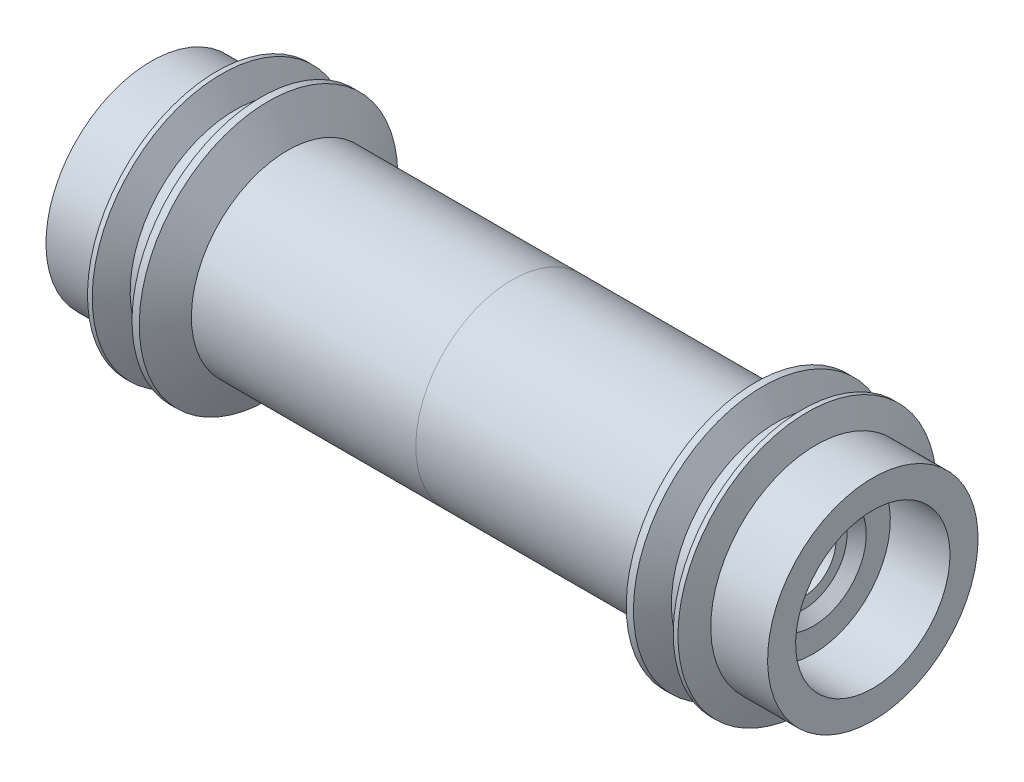
ISO-10303-21;
HEADER;
FILE_DESCRIPTION(('STEP AP214'),'2;1');
FILE_NAME('part.step','',(''),(''),'','','');
FILE_SCHEMA(('AUTOMOTIVE_DESIGN { 1 0 10303 214 1 1 1 1 }'));
ENDSEC;
DATA;
#1=APPLICATION_CONTEXT('core data for automotive mechanical design processes');
#2=APPLICATION_PROTOCOL_DEFINITION('international standard','automotive_design',2000,#1);
#3=PRODUCT_CONTEXT('',#1,'mechanical');
#4=PRODUCT('Part','Part','',(#3));
#5=PRODUCT_RELATED_PRODUCT_CATEGORY('part','',(#4));
#6=PRODUCT_DEFINITION_FORMATION('','',#4);
#7=PRODUCT_DEFINITION_CONTEXT('part definition',#1,'design');
#8=PRODUCT_DEFINITION('design','',#6,#7);
#9=PRODUCT_DEFINITION_SHAPE('','',#8);
#10=(LENGTH_UNIT() NAMED_UNIT(*) SI_UNIT(.MILLI.,.METRE.));
#11=(NAMED_UNIT(*) PLANE_ANGLE_UNIT() SI_UNIT($,.RADIAN.));
#12=(NAMED_UNIT(*) SI_UNIT($,.STERADIAN.) SOLID_ANGLE_UNIT());
#13=UNCERTAINTY_MEASURE_WITH_UNIT(LENGTH_MEASURE(1.E-05),#10,'distance_accuracy_value','');
#14=(GEOMETRIC_REPRESENTATION_CONTEXT(3) GLOBAL_UNCERTAINTY_ASSIGNED_CONTEXT((#13)) GLOBAL_UNIT_ASSIGNED_CONTEXT((#10,
#11,#12)) REPRESENTATION_CONTEXT('',''));
#15=CARTESIAN_POINT('',(0.,0.,0.));
#16=DIRECTION('',(0.,0.,1.));
#17=DIRECTION('',(1.,0.,0.));
#18=AXIS2_PLACEMENT_3D('',#15,#16,#17);
#19=CARTESIAN_POINT('',(13.97,0.,0.));
#20=DIRECTION('',(-1.,0.,0.));
#21=DIRECTION('',(0.,1.,0.));
#22=AXIS2_PLACEMENT_3D('',#19,#20,#21);
#23=CONICAL_SURFACE('',#22,5.55625,1.0471975511966);
#24=CARTESIAN_POINT('',(13.2367651581292,0.,0.));
#25=DIRECTION('',(-1.,0.,0.));
#26=DIRECTION('',(0.,-1.,0.));
#27=AXIS2_PLACEMENT_3D('',#24,#25,#26);
#28=CIRCLE('',#27,6.82625);
#29=CARTESIAN_POINT('',(13.2367651581292,-6.82625,0.));
#30=VERTEX_POINT('',#29);
#31=EDGE_CURVE('E177',#30,#30,#28,.T.);
#32=ORIENTED_EDGE('',*,*,#31,.F.);
#33=EDGE_LOOP('',(#32));
#34=FACE_BOUND('',#33,.T.);
#35=CARTESIAN_POINT('',(13.97,0.,0.));
#36=DIRECTION('',(-1.,0.,0.));
#37=DIRECTION('',(0.,-1.,0.));
#38=AXIS2_PLACEMENT_3D('',#35,#36,#37);
#39=CIRCLE('',#38,5.55625);
#40=CARTESIAN_POINT('',(13.97,-5.55625,0.));
#41=VERTEX_POINT('',#40);
#42=EDGE_CURVE('E12',#41,#41,#39,.T.);
#43=ORIENTED_EDGE('',*,*,#42,.T.);
#44=EDGE_LOOP('',(#43));
#45=FACE_BOUND('',#44,.T.);
#46=ADVANCED_FACE('F59',(#34,#45),#23,.T.);
#47=CARTESIAN_POINT('',(19.05,0.,0.));
#48=DIRECTION('',(1.,0.,0.));
#49=DIRECTION('',(0.,-1.,0.));
#50=AXIS2_PLACEMENT_3D('',#47,#48,#49);
#51=CYLINDRICAL_SURFACE('',#50,5.55625);
#52=ORIENTED_EDGE('',*,*,#42,.F.);
#53=EDGE_LOOP('',(#52));
#54=FACE_BOUND('',#53,.T.);
#55=CARTESIAN_POINT('',(14.605,0.,0.));
#56=DIRECTION('',(-1.,0.,0.));
#57=DIRECTION('',(0.,-1.,0.));
#58=AXIS2_PLACEMENT_3D('',#55,#56,#57);
#59=CIRCLE('',#58,5.55625);
#60=CARTESIAN_POINT('',(14.605,-5.55625,0.));
#61=VERTEX_POINT('',#60);
#62=EDGE_CURVE('E66',#61,#61,#59,.T.);
#63=ORIENTED_EDGE('',*,*,#62,.T.);
#64=EDGE_LOOP('',(#63));
#65=FACE_BOUND('',#64,.T.);
#66=ADVANCED_FACE('F131',(#54,#65),#51,.T.);
#67=CARTESIAN_POINT('',(15.3382348418708,0.,0.));
#68=DIRECTION('',(1.,0.,0.));
#69=DIRECTION('',(0.,-1.,0.));
#70=AXIS2_PLACEMENT_3D('',#67,#68,#69);
#71=CONICAL_SURFACE('',#70,6.82625,1.0471975511966);
#72=ORIENTED_EDGE('',*,*,#62,.F.);
#73=EDGE_LOOP('',(#72));
#74=FACE_BOUND('',#73,.T.);
#75=CARTESIAN_POINT('',(15.3382348418708,0.,0.));
#76=DIRECTION('',(-1.,0.,0.));
#77=DIRECTION('',(0.,-1.,0.));
#78=AXIS2_PLACEMENT_3D('',#75,#76,#77);
#79=CIRCLE('',#78,6.82625);
#80=CARTESIAN_POINT('',(15.3382348418708,-6.82625,0.));
#81=VERTEX_POINT('',#80);
#82=EDGE_CURVE('E124',#81,#81,#79,.T.);
#83=ORIENTED_EDGE('',*,*,#82,.T.);
#84=EDGE_LOOP('',(#83));
#85=FACE_BOUND('',#84,.T.);
#86=ADVANCED_FACE('F133',(#74,#85),#71,.T.);
#87=CARTESIAN_POINT('',(19.05,0.,0.));
#88=DIRECTION('',(1.,0.,0.));
#89=DIRECTION('',(0.,-1.,0.));
#90=AXIS2_PLACEMENT_3D('',#87,#88,#89);
#91=CYLINDRICAL_SURFACE('',#90,6.82625);
#92=ORIENTED_EDGE('',*,*,#82,.F.);
#93=EDGE_LOOP('',(#92));
#94=FACE_BOUND('',#93,.T.);
#95=CARTESIAN_POINT('',(15.5877578024819,0.,0.));
#96=DIRECTION('',(-1.,0.,0.));
#97=DIRECTION('',(0.,-1.,0.));
#98=AXIS2_PLACEMENT_3D('',#95,#96,#97);
#99=CIRCLE('',#98,6.82625);
#100=CARTESIAN_POINT('',(15.5877578024819,-6.82625,0.));
#101=VERTEX_POINT('',#100);
#102=EDGE_CURVE('E120',#101,#101,#99,.T.);
#103=ORIENTED_EDGE('',*,*,#102,.T.);
#104=EDGE_LOOP('',(#103));
#105=FACE_BOUND('',#104,.T.);
#106=ADVANCED_FACE('F136',(#94,#105),#91,.T.);
#107=CARTESIAN_POINT('',(16.05,0.,0.));
#108=DIRECTION('',(-1.,0.,0.));
#109=DIRECTION('',(0.,1.,0.));
#110=AXIS2_PLACEMENT_3D('',#107,#108,#109);
#111=CONICAL_SURFACE('',#110,5.55625,1.22173047639603);
#112=ORIENTED_EDGE('',*,*,#102,.F.);
#113=EDGE_LOOP('',(#112));
#114=FACE_BOUND('',#113,.T.);
#115=CARTESIAN_POINT('',(16.05,0.,0.));
#116=DIRECTION('',(-1.,0.,0.));
#117=DIRECTION('',(0.,-1.,0.));
#118=AXIS2_PLACEMENT_3D('',#115,#116,#117);
#119=CIRCLE('',#118,5.55625);
#120=CARTESIAN_POINT('',(16.05,-5.55625,0.));
#121=VERTEX_POINT('',#120);
#122=EDGE_CURVE('E116',#121,#121,#119,.T.);
#123=ORIENTED_EDGE('',*,*,#122,.T.);
#124=EDGE_LOOP('',(#123));
#125=FACE_BOUND('',#124,.T.);
#126=ADVANCED_FACE('F142',(#114,#125),#111,.T.);
#127=CARTESIAN_POINT('',(19.05,0.,0.));
#128=DIRECTION('',(1.,0.,0.));
#129=DIRECTION('',(0.,-1.,0.));
#130=AXIS2_PLACEMENT_3D('',#127,#128,#129);
#131=CYLINDRICAL_SURFACE('',#130,5.55625);
#132=ORIENTED_EDGE('',*,*,#122,.F.);
#133=EDGE_LOOP('',(#132));
#134=FACE_BOUND('',#133,.T.);
#135=CARTESIAN_POINT('',(19.05,0.,0.));
#136=DIRECTION('',(-1.,0.,0.));
#137=DIRECTION('',(0.,-1.,0.));
#138=AXIS2_PLACEMENT_3D('',#135,#136,#137);
#139=CIRCLE('',#138,5.55625);
#140=CARTESIAN_POINT('',(19.05,-5.55625,0.));
#141=VERTEX_POINT('',#140);
#142=EDGE_CURVE('E112',#141,#141,#139,.T.);
#143=ORIENTED_EDGE('',*,*,#142,.T.);
#144=EDGE_LOOP('',(#143));
#145=FACE_BOUND('',#144,.T.);
#146=ADVANCED_FACE('F148',(#134,#145),#131,.T.);
#147=CARTESIAN_POINT('',(19.05,0.,0.));
#148=DIRECTION('',(-1.,0.,0.));
#149=DIRECTION('',(0.,1.,0.));
#150=AXIS2_PLACEMENT_3D('',#147,#148,#149);
#151=PLANE('',#150);
#152=CARTESIAN_POINT('',(19.05,0.,0.));
#153=DIRECTION('',(-1.,0.,0.));
#154=DIRECTION('',(0.,-1.,0.));
#155=AXIS2_PLACEMENT_3D('',#152,#153,#154);
#156=CIRCLE('',#155,4.075);
#157=CARTESIAN_POINT('',(19.05,-4.075,0.));
#158=VERTEX_POINT('',#157);
#159=EDGE_CURVE('E108',#158,#158,#156,.T.);
#160=ORIENTED_EDGE('',*,*,#159,.T.);
#161=EDGE_LOOP('',(#160));
#162=FACE_BOUND('',#161,.T.);
#163=ORIENTED_EDGE('',*,*,#142,.F.);
#164=EDGE_LOOP('',(#163));
#165=FACE_BOUND('',#164,.T.);
#166=ADVANCED_FACE('F154',(#162,#165),#151,.F.);
#167=CARTESIAN_POINT('',(19.05,0.,0.));
#168=DIRECTION('',(1.,0.,0.));
#169=DIRECTION('',(0.,-1.,0.));
#170=AXIS2_PLACEMENT_3D('',#167,#168,#169);
#171=CYLINDRICAL_SURFACE('',#170,4.075);
#172=CARTESIAN_POINT('',(15.9,0.,0.));
#173=DIRECTION('',(-1.,0.,0.));
#174=DIRECTION('',(0.,-1.,0.));
#175=AXIS2_PLACEMENT_3D('',#172,#173,#174);
#176=CIRCLE('',#175,4.075);
#177=CARTESIAN_POINT('',(15.9,-4.075,0.));
#178=VERTEX_POINT('',#177);
#179=EDGE_CURVE('E104',#178,#178,#176,.T.);
#180=ORIENTED_EDGE('',*,*,#179,.T.);
#181=EDGE_LOOP('',(#180));
#182=FACE_BOUND('',#181,.T.);
#183=ORIENTED_EDGE('',*,*,#159,.F.);
#184=EDGE_LOOP('',(#183));
#185=FACE_BOUND('',#184,.T.);
#186=ADVANCED_FACE('F159',(#182,#185),#171,.F.);
#187=CARTESIAN_POINT('',(15.9,0.,0.));
#188=DIRECTION('',(-1.,0.,0.));
#189=DIRECTION('',(0.,1.,0.));
#190=AXIS2_PLACEMENT_3D('',#187,#188,#189);
#191=PLANE('',#190);
#192=CARTESIAN_POINT('',(15.9,0.,0.));
#193=DIRECTION('',(-1.,0.,0.));
#194=DIRECTION('',(0.,-1.,0.));
#195=AXIS2_PLACEMENT_3D('',#192,#193,#194);
#196=CIRCLE('',#195,2.805);
#197=CARTESIAN_POINT('',(15.9,-2.805,0.));
#198=VERTEX_POINT('',#197);
#199=EDGE_CURVE('E100',#198,#198,#196,.T.);
#200=ORIENTED_EDGE('',*,*,#199,.T.);
#201=EDGE_LOOP('',(#200));
#202=FACE_BOUND('',#201,.T.);
#203=ORIENTED_EDGE('',*,*,#179,.F.);
#204=EDGE_LOOP('',(#203));
#205=FACE_BOUND('',#204,.T.);
#206=ADVANCED_FACE('F165',(#202,#205),#191,.F.);
#207=CARTESIAN_POINT('',(15.9,0.,0.));
#208=DIRECTION('',(1.,0.,0.));
#209=DIRECTION('',(0.,-1.,0.));
#210=AXIS2_PLACEMENT_3D('',#207,#208,#209);
#211=CONICAL_SURFACE('',#210,2.805,0.785398163397445);
#212=CARTESIAN_POINT('',(15.392,0.,0.));
#213=DIRECTION('',(-1.,0.,0.));
#214=DIRECTION('',(0.,-1.,0.));
#215=AXIS2_PLACEMENT_3D('',#212,#213,#214);
#216=CIRCLE('',#215,2.297);
#217=CARTESIAN_POINT('',(15.392,-2.297,0.));
#218=VERTEX_POINT('',#217);
#219=EDGE_CURVE('E96',#218,#218,#216,.T.);
#220=ORIENTED_EDGE('',*,*,#219,.T.);
#221=EDGE_LOOP('',(#220));
#222=FACE_BOUND('',#221,.T.);
#223=ORIENTED_EDGE('',*,*,#199,.F.);
#224=EDGE_LOOP('',(#223));
#225=FACE_BOUND('',#224,.T.);
#226=ADVANCED_FACE('F229',(#222,#225),#211,.F.);
#227=CARTESIAN_POINT('',(15.392,0.,0.));
#228=DIRECTION('',(-1.,0.,0.));
#229=DIRECTION('',(0.,1.,0.));
#230=AXIS2_PLACEMENT_3D('',#227,#228,#229);
#231=PLANE('',#230);
#232=CARTESIAN_POINT('',(15.392,0.,0.));
#233=DIRECTION('',(-1.,0.,0.));
#234=DIRECTION('',(0.,-1.,0.));
#235=AXIS2_PLACEMENT_3D('',#232,#233,#234);
#236=CIRCLE('',#235,1.7145);
#237=CARTESIAN_POINT('',(15.392,-1.7145,0.));
#238=VERTEX_POINT('',#237);
#239=EDGE_CURVE('E86',#238,#238,#236,.T.);
#240=ORIENTED_EDGE('',*,*,#239,.T.);
#241=EDGE_LOOP('',(#240));
#242=FACE_BOUND('',#241,.T.);
#243=ORIENTED_EDGE('',*,*,#219,.F.);
#244=EDGE_LOOP('',(#243));
#245=FACE_BOUND('',#244,.T.);
#246=ADVANCED_FACE('F225',(#242,#245),#231,.F.);
#247=CARTESIAN_POINT('',(19.05,0.,0.));
#248=DIRECTION('',(1.,0.,0.));
#249=DIRECTION('',(0.,-1.,0.));
#250=AXIS2_PLACEMENT_3D('',#247,#248,#249);
#251=CYLINDRICAL_SURFACE('',#250,1.7145);
#252=CARTESIAN_POINT('',(9.225,0.,0.));
#253=DIRECTION('',(-1.,0.,0.));
#254=DIRECTION('',(0.,-1.,0.));
#255=AXIS2_PLACEMENT_3D('',#252,#253,#254);
#256=CIRCLE('',#255,1.7145);
#257=CARTESIAN_POINT('',(9.225,-1.7145,0.));
#258=VERTEX_POINT('',#257);
#259=EDGE_CURVE('E80',#258,#258,#256,.T.);
#260=ORIENTED_EDGE('',*,*,#259,.T.);
#261=EDGE_LOOP('',(#260));
#262=FACE_BOUND('',#261,.T.);
#263=ORIENTED_EDGE('',*,*,#239,.F.);
#264=EDGE_LOOP('',(#263));
#265=FACE_BOUND('',#264,.T.);
#266=ADVANCED_FACE('F221',(#262,#265),#251,.F.);
#267=CARTESIAN_POINT('',(9.225,0.,0.));
#268=DIRECTION('',(-1.,0.,0.));
#269=DIRECTION('',(0.,1.,0.));
#270=AXIS2_PLACEMENT_3D('',#267,#268,#269);
#271=PLANE('',#270);
#272=ORIENTED_EDGE('',*,*,#259,.F.);
#273=EDGE_LOOP('',(#272));
#274=FACE_BOUND('',#273,.T.);
#275=ADVANCED_FACE('F73',(#274),#271,.F.);
#276=CARTESIAN_POINT('',(6.5,0.,0.));
#277=DIRECTION('',(-1.,0.,0.));
#278=DIRECTION('',(0.,1.,0.));
#279=AXIS2_PLACEMENT_3D('',#276,#277,#278);
#280=CONICAL_SURFACE('',#279,1.6,0.78539816339745);
#281=CARTESIAN_POINT('',(8.09999999999999,0.,0.));
#282=VERTEX_POINT('',#281);
#283=VERTEX_LOOP('',#282);
#284=FACE_BOUND('',#283,.T.);
#285=CARTESIAN_POINT('',(6.5,0.,0.));
#286=DIRECTION('',(-1.,0.,0.));
#287=DIRECTION('',(0.,-1.,0.));
#288=AXIS2_PLACEMENT_3D('',#285,#286,#287);
#289=CIRCLE('',#288,1.6);
#290=CARTESIAN_POINT('',(6.5,-1.6,0.));
#291=VERTEX_POINT('',#290);
#292=EDGE_CURVE('E77',#291,#291,#289,.T.);
#293=ORIENTED_EDGE('',*,*,#292,.T.);
#294=EDGE_LOOP('',(#293));
#295=FACE_BOUND('',#294,.T.);
#296=ADVANCED_FACE('F69',(#284,#295),#280,.F.);
#297=CARTESIAN_POINT('',(19.05,0.,0.));
#298=DIRECTION('',(1.,0.,0.));
#299=DIRECTION('',(0.,-1.,0.));
#300=AXIS2_PLACEMENT_3D('',#297,#298,#299);
#301=CYLINDRICAL_SURFACE('',#300,1.6);
#302=ORIENTED_EDGE('',*,*,#292,.F.);
#303=EDGE_LOOP('',(#302));
#304=FACE_BOUND('',#303,.T.);
#305=CARTESIAN_POINT('',(0.,0.,0.));
#306=DIRECTION('',(-1.,0.,0.));
#307=DIRECTION('',(0.,-1.,0.));
#308=AXIS2_PLACEMENT_3D('',#305,#306,#307);
#309=CIRCLE('',#308,1.6);
#310=CARTESIAN_POINT('',(0.,-1.6,0.));
#311=VERTEX_POINT('',#310);
#312=EDGE_CURVE('E81',#311,#311,#309,.T.);
#313=ORIENTED_EDGE('',*,*,#312,.T.);
#314=EDGE_LOOP('',(#313));
#315=FACE_BOUND('',#314,.T.);
#316=ADVANCED_FACE('F72',(#304,#315),#301,.F.);
#317=CARTESIAN_POINT('',(0.,0.,0.));
#318=DIRECTION('',(1.,0.,0.));
#319=DIRECTION('',(0.,-1.,0.));
#320=AXIS2_PLACEMENT_3D('',#317,#318,#319);
#321=PLANE('',#320);
#322=CARTESIAN_POINT('',(0.,0.,0.));
#323=DIRECTION('',(-1.,0.,0.));
#324=DIRECTION('',(0.,-1.,0.));
#325=AXIS2_PLACEMENT_3D('',#322,#323,#324);
#326=CIRCLE('',#325,5.08);
#327=CARTESIAN_POINT('',(0.,-5.08,0.));
#328=VERTEX_POINT('',#327);
#329=EDGE_CURVE('E89',#328,#328,#326,.T.);
#330=ORIENTED_EDGE('',*,*,#329,.T.);
#331=EDGE_LOOP('',(#330));
#332=FACE_BOUND('',#331,.T.);
#333=ORIENTED_EDGE('',*,*,#312,.F.);
#334=EDGE_LOOP('',(#333));
#335=FACE_BOUND('',#334,.T.);
#336=ADVANCED_FACE('F194',(#332,#335),#321,.F.);
#337=CARTESIAN_POINT('',(19.05,0.,0.));
#338=DIRECTION('',(1.,0.,0.));
#339=DIRECTION('',(0.,-1.,0.));
#340=AXIS2_PLACEMENT_3D('',#337,#338,#339);
#341=CYLINDRICAL_SURFACE('',#340,5.08);
#342=ORIENTED_EDGE('',*,*,#329,.F.);
#343=EDGE_LOOP('',(#342));
#344=FACE_BOUND('',#343,.T.);
#345=CARTESIAN_POINT('',(11.8475672505568,0.,0.));
#346=DIRECTION('',(-1.,0.,0.));
#347=DIRECTION('',(0.,-1.,0.));
#348=AXIS2_PLACEMENT_3D('',#345,#346,#347);
#349=CIRCLE('',#348,5.08);
#350=CARTESIAN_POINT('',(11.8475672505568,-5.08,0.));
#351=VERTEX_POINT('',#350);
#352=EDGE_CURVE('E185',#351,#351,#349,.T.);
#353=ORIENTED_EDGE('',*,*,#352,.T.);
#354=EDGE_LOOP('',(#353));
#355=FACE_BOUND('',#354,.T.);
#356=ADVANCED_FACE('F197',(#344,#355),#341,.T.);
#357=CARTESIAN_POINT('',(12.8557651581292,0.,0.));
#358=DIRECTION('',(1.,0.,0.));
#359=DIRECTION('',(0.,-1.,0.));
#360=AXIS2_PLACEMENT_3D('',#357,#358,#359);
#361=CONICAL_SURFACE('',#360,6.82625,1.0471975511966);
#362=ORIENTED_EDGE('',*,*,#352,.F.);
#363=EDGE_LOOP('',(#362));
#364=FACE_BOUND('',#363,.T.);
#365=CARTESIAN_POINT('',(12.8557651581292,0.,0.));
#366=DIRECTION('',(-1.,0.,0.));
#367=DIRECTION('',(0.,-1.,0.));
#368=AXIS2_PLACEMENT_3D('',#365,#366,#367);
#369=CIRCLE('',#368,6.82625);
#370=CARTESIAN_POINT('',(12.8557651581292,-6.82625,0.));
#371=VERTEX_POINT('',#370);
#372=EDGE_CURVE('E181',#371,#371,#369,.T.);
#373=ORIENTED_EDGE('',*,*,#372,.T.);
#374=EDGE_LOOP('',(#373));
#375=FACE_BOUND('',#374,.T.);
#376=ADVANCED_FACE('F200',(#364,#375),#361,.T.);
#377=CARTESIAN_POINT('',(19.05,0.,0.));
#378=DIRECTION('',(1.,0.,0.));
#379=DIRECTION('',(0.,-1.,0.));
#380=AXIS2_PLACEMENT_3D('',#377,#378,#379);
#381=CYLINDRICAL_SURFACE('',#380,6.82625);
#382=ORIENTED_EDGE('',*,*,#372,.F.);
#383=EDGE_LOOP('',(#382));
#384=FACE_BOUND('',#383,.T.);
#385=ORIENTED_EDGE('',*,*,#31,.T.);
#386=EDGE_LOOP('',(#385));
#387=FACE_BOUND('',#386,.T.);
#388=ADVANCED_FACE('F206',(#384,#387),#381,.T.);
#389=CLOSED_SHELL('',(#46,#66,#86,#106,#126,#146,#166,#186,#206,#226,#246,#266,#275,#296,#316,
#336,#356,#376,#388));
#390=MANIFOLD_SOLID_BREP('B2',#389);
#391=CARTESIAN_POINT('',(-13.97,0.,0.));
#392=DIRECTION('',(1.,0.,0.));
#393=DIRECTION('',(0.,1.,0.));
#394=AXIS2_PLACEMENT_3D('',#391,#392,#393);
#395=CONICAL_SURFACE('',#394,5.55625,1.0471975511966);
#396=CARTESIAN_POINT('',(-13.2367651581292,0.,0.));
#397=DIRECTION('',(-1.,0.,0.));
#398=DIRECTION('',(0.,-1.,0.));
#399=AXIS2_PLACEMENT_3D('',#396,#397,#398);
#400=CIRCLE('',#399,6.82625);
#401=CARTESIAN_POINT('',(-13.2367651581292,-6.82625,0.));
#402=VERTEX_POINT('',#401);
#403=EDGE_CURVE('E509',#402,#402,#400,.T.);
#404=ORIENTED_EDGE('',*,*,#403,.T.);
#405=EDGE_LOOP('',(#404));
#406=FACE_BOUND('',#405,.T.);
#407=CARTESIAN_POINT('',(-13.97,0.,0.));
#408=DIRECTION('',(-1.,0.,0.));
#409=DIRECTION('',(0.,-1.,0.));
#410=AXIS2_PLACEMENT_3D('',#407,#408,#409);
#411=CIRCLE('',#410,5.55625);
#412=CARTESIAN_POINT('',(-13.97,-5.55625,0.));
#413=VERTEX_POINT('',#412);
#414=EDGE_CURVE('E418',#413,#413,#411,.T.);
#415=ORIENTED_EDGE('',*,*,#414,.F.);
#416=EDGE_LOOP('',(#415));
#417=FACE_BOUND('',#416,.T.);
#418=ADVANCED_FACE('F360',(#406,#417),#395,.T.);
#419=CARTESIAN_POINT('',(-19.05,0.,0.));
#420=DIRECTION('',(-1.,0.,0.));
#421=DIRECTION('',(0.,-1.,0.));
#422=AXIS2_PLACEMENT_3D('',#419,#420,#421);
#423=CYLINDRICAL_SURFACE('',#422,5.55625);
#424=ORIENTED_EDGE('',*,*,#414,.T.);
#425=EDGE_LOOP('',(#424));
#426=FACE_BOUND('',#425,.T.);
#427=CARTESIAN_POINT('',(-14.605,0.,0.));
#428=DIRECTION('',(-1.,0.,0.));
#429=DIRECTION('',(0.,-1.,0.));
#430=AXIS2_PLACEMENT_3D('',#427,#428,#429);
#431=CIRCLE('',#430,5.55625);
#432=CARTESIAN_POINT('',(-14.605,-5.55625,0.));
#433=VERTEX_POINT('',#432);
#434=EDGE_CURVE('E415',#433,#433,#431,.T.);
#435=ORIENTED_EDGE('',*,*,#434,.F.);
#436=EDGE_LOOP('',(#435));
#437=FACE_BOUND('',#436,.T.);
#438=ADVANCED_FACE('F438',(#426,#437),#423,.T.);
#439=CARTESIAN_POINT('',(-15.3382348418708,0.,0.));
#440=DIRECTION('',(-1.,0.,0.));
#441=DIRECTION('',(0.,-1.,0.));
#442=AXIS2_PLACEMENT_3D('',#439,#440,#441);
#443=CONICAL_SURFACE('',#442,6.82625,1.0471975511966);
#444=ORIENTED_EDGE('',*,*,#434,.T.);
#445=EDGE_LOOP('',(#444));
#446=FACE_BOUND('',#445,.T.);
#447=CARTESIAN_POINT('',(-15.3382348418708,0.,0.));
#448=DIRECTION('',(-1.,0.,0.));
#449=DIRECTION('',(0.,-1.,0.));
#450=AXIS2_PLACEMENT_3D('',#447,#448,#449);
#451=CIRCLE('',#450,6.82625);
#452=CARTESIAN_POINT('',(-15.3382348418708,-6.82625,0.));
#453=VERTEX_POINT('',#452);
#454=EDGE_CURVE('E412',#453,#453,#451,.T.);
#455=ORIENTED_EDGE('',*,*,#454,.F.);
#456=EDGE_LOOP('',(#455));
#457=FACE_BOUND('',#456,.T.);
#458=ADVANCED_FACE('F443',(#446,#457),#443,.T.);
#459=CARTESIAN_POINT('',(-19.05,0.,0.));
#460=DIRECTION('',(-1.,0.,0.));
#461=DIRECTION('',(0.,-1.,0.));
#462=AXIS2_PLACEMENT_3D('',#459,#460,#461);
#463=CYLINDRICAL_SURFACE('',#462,6.82625);
#464=ORIENTED_EDGE('',*,*,#454,.T.);
#465=EDGE_LOOP('',(#464));
#466=FACE_BOUND('',#465,.T.);
#467=CARTESIAN_POINT('',(-15.5877578024819,0.,0.));
#468=DIRECTION('',(-1.,0.,0.));
#469=DIRECTION('',(0.,-1.,0.));
#470=AXIS2_PLACEMENT_3D('',#467,#468,#469);
#471=CIRCLE('',#470,6.82625);
#472=CARTESIAN_POINT('',(-15.5877578024819,-6.82625,0.));
#473=VERTEX_POINT('',#472);
#474=EDGE_CURVE('E409',#473,#473,#471,.T.);
#475=ORIENTED_EDGE('',*,*,#474,.F.);
#476=EDGE_LOOP('',(#475));
#477=FACE_BOUND('',#476,.T.);
#478=ADVANCED_FACE('F451',(#466,#477),#463,.T.);
#479=CARTESIAN_POINT('',(-16.05,0.,0.));
#480=DIRECTION('',(1.,0.,0.));
#481=DIRECTION('',(0.,1.,0.));
#482=AXIS2_PLACEMENT_3D('',#479,#480,#481);
#483=CONICAL_SURFACE('',#482,5.55625,1.22173047639603);
#484=ORIENTED_EDGE('',*,*,#474,.T.);
#485=EDGE_LOOP('',(#484));
#486=FACE_BOUND('',#485,.T.);
#487=CARTESIAN_POINT('',(-16.05,0.,0.));
#488=DIRECTION('',(-1.,0.,0.));
#489=DIRECTION('',(0.,-1.,0.));
#490=AXIS2_PLACEMENT_3D('',#487,#488,#489);
#491=CIRCLE('',#490,5.55625);
#492=CARTESIAN_POINT('',(-16.05,-5.55625,0.));
#493=VERTEX_POINT('',#492);
#494=EDGE_CURVE('E406',#493,#493,#491,.T.);
#495=ORIENTED_EDGE('',*,*,#494,.F.);
#496=EDGE_LOOP('',(#495));
#497=FACE_BOUND('',#496,.T.);
#498=ADVANCED_FACE('F455',(#486,#497),#483,.T.);
#499=CARTESIAN_POINT('',(-19.05,0.,0.));
#500=DIRECTION('',(-1.,0.,0.));
#501=DIRECTION('',(0.,-1.,0.));
#502=AXIS2_PLACEMENT_3D('',#499,#500,#501);
#503=CYLINDRICAL_SURFACE('',#502,5.55625);
#504=ORIENTED_EDGE('',*,*,#494,.T.);
#505=EDGE_LOOP('',(#504));
#506=FACE_BOUND('',#505,.T.);
#507=CARTESIAN_POINT('',(-19.05,0.,0.));
#508=DIRECTION('',(-1.,0.,0.));
#509=DIRECTION('',(0.,-1.,0.));
#510=AXIS2_PLACEMENT_3D('',#507,#508,#509);
#511=CIRCLE('',#510,5.55625);
#512=CARTESIAN_POINT('',(-19.05,-5.55625,0.));
#513=VERTEX_POINT('',#512);
#514=EDGE_CURVE('E403',#513,#513,#511,.T.);
#515=ORIENTED_EDGE('',*,*,#514,.F.);
#516=EDGE_LOOP('',(#515));
#517=FACE_BOUND('',#516,.T.);
#518=ADVANCED_FACE('F459',(#506,#517),#503,.T.);
#519=CARTESIAN_POINT('',(-19.05,0.,0.));
#520=DIRECTION('',(1.,0.,0.));
#521=DIRECTION('',(0.,1.,0.));
#522=AXIS2_PLACEMENT_3D('',#519,#520,#521);
#523=PLANE('',#522);
#524=CARTESIAN_POINT('',(-19.05,0.,0.));
#525=DIRECTION('',(1.,0.,0.));
#526=DIRECTION('',(0.,1.,0.));
#527=AXIS2_PLACEMENT_3D('',#524,#525,#526);
#528=CIRCLE('',#527,4.583);
#529=CARTESIAN_POINT('',(-19.05,4.583,0.));
#530=VERTEX_POINT('',#529);
#531=EDGE_CURVE('E57',#530,#530,#528,.T.);
#532=ORIENTED_EDGE('',*,*,#531,.T.);
#533=EDGE_LOOP('',(#532));
#534=FACE_BOUND('',#533,.T.);
#535=ORIENTED_EDGE('',*,*,#514,.T.);
#536=EDGE_LOOP('',(#535));
#537=FACE_BOUND('',#536,.T.);
#538=ADVANCED_FACE('F463',(#534,#537),#523,.F.);
#539=CARTESIAN_POINT('',(-19.05,0.,0.));
#540=DIRECTION('',(-1.,0.,0.));
#541=DIRECTION('',(0.,-1.,0.));
#542=AXIS2_PLACEMENT_3D('',#539,#540,#541);
#543=CYLINDRICAL_SURFACE('',#542,4.075);
#544=CARTESIAN_POINT('',(-18.542,0.,0.));
#545=DIRECTION('',(1.,0.,0.));
#546=DIRECTION('',(0.,1.,0.));
#547=AXIS2_PLACEMENT_3D('',#544,#545,#546);
#548=CIRCLE('',#547,4.075);
#549=CARTESIAN_POINT('',(-18.542,4.075,0.));
#550=VERTEX_POINT('',#549);
#551=EDGE_CURVE('E368',#550,#550,#548,.F.);
#552=ORIENTED_EDGE('',*,*,#551,.T.);
#553=EDGE_LOOP('',(#552));
#554=FACE_BOUND('',#553,.T.);
#555=CARTESIAN_POINT('',(-15.9,0.,0.));
#556=DIRECTION('',(-1.,0.,0.));
#557=DIRECTION('',(0.,-1.,0.));
#558=AXIS2_PLACEMENT_3D('',#555,#556,#557);
#559=CIRCLE('',#558,4.075);
#560=CARTESIAN_POINT('',(-15.9,-4.075,0.));
#561=VERTEX_POINT('',#560);
#562=EDGE_CURVE('E400',#561,#561,#559,.T.);
#563=ORIENTED_EDGE('',*,*,#562,.F.);
#564=EDGE_LOOP('',(#563));
#565=FACE_BOUND('',#564,.T.);
#566=ADVANCED_FACE('F423',(#554,#565),#543,.F.);
#567=CARTESIAN_POINT('',(-15.9,0.,0.));
#568=DIRECTION('',(1.,0.,0.));
#569=DIRECTION('',(0.,1.,0.));
#570=AXIS2_PLACEMENT_3D('',#567,#568,#569);
#571=PLANE('',#570);
#572=CARTESIAN_POINT('',(-15.9,0.,0.));
#573=DIRECTION('',(-1.,0.,0.));
#574=DIRECTION('',(0.,-1.,0.));
#575=AXIS2_PLACEMENT_3D('',#572,#573,#574);
#576=CIRCLE('',#575,2.805);
#577=CARTESIAN_POINT('',(-15.9,-2.805,0.));
#578=VERTEX_POINT('',#577);
#579=EDGE_CURVE('E397',#578,#578,#576,.T.);
#580=ORIENTED_EDGE('',*,*,#579,.F.);
#581=EDGE_LOOP('',(#580));
#582=FACE_BOUND('',#581,.T.);
#583=ORIENTED_EDGE('',*,*,#562,.T.);
#584=EDGE_LOOP('',(#583));
#585=FACE_BOUND('',#584,.T.);
#586=ADVANCED_FACE('F469',(#582,#585),#571,.F.);
#587=CARTESIAN_POINT('',(-15.9,0.,0.));
#588=DIRECTION('',(-1.,0.,0.));
#589=DIRECTION('',(0.,-1.,0.));
#590=AXIS2_PLACEMENT_3D('',#587,#588,#589);
#591=CONICAL_SURFACE('',#590,2.805,0.785398163397445);
#592=CARTESIAN_POINT('',(-15.392,0.,0.));
#593=DIRECTION('',(-1.,0.,0.));
#594=DIRECTION('',(0.,-1.,0.));
#595=AXIS2_PLACEMENT_3D('',#592,#593,#594);
#596=CIRCLE('',#595,2.297);
#597=CARTESIAN_POINT('',(-15.392,-2.297,0.));
#598=VERTEX_POINT('',#597);
#599=EDGE_CURVE('E394',#598,#598,#596,.T.);
#600=ORIENTED_EDGE('',*,*,#599,.F.);
#601=EDGE_LOOP('',(#600));
#602=FACE_BOUND('',#601,.T.);
#603=ORIENTED_EDGE('',*,*,#579,.T.);
#604=EDGE_LOOP('',(#603));
#605=FACE_BOUND('',#604,.T.);
#606=ADVANCED_FACE('F472',(#602,#605),#591,.F.);
#607=CARTESIAN_POINT('',(-15.392,0.,0.));
#608=DIRECTION('',(1.,0.,0.));
#609=DIRECTION('',(0.,1.,0.));
#610=AXIS2_PLACEMENT_3D('',#607,#608,#609);
#611=PLANE('',#610);
#612=CARTESIAN_POINT('',(-15.392,0.,0.));
#613=DIRECTION('',(-1.,0.,0.));
#614=DIRECTION('',(0.,-1.,0.));
#615=AXIS2_PLACEMENT_3D('',#612,#613,#614);
#616=CIRCLE('',#615,1.7145);
#617=CARTESIAN_POINT('',(-15.392,-1.7145,0.));
#618=VERTEX_POINT('',#617);
#619=EDGE_CURVE('E385',#618,#618,#616,.T.);
#620=ORIENTED_EDGE('',*,*,#619,.F.);
#621=EDGE_LOOP('',(#620));
#622=FACE_BOUND('',#621,.T.);
#623=ORIENTED_EDGE('',*,*,#599,.T.);
#624=EDGE_LOOP('',(#623));
#625=FACE_BOUND('',#624,.T.);
#626=ADVANCED_FACE('F476',(#622,#625),#611,.F.);
#627=CARTESIAN_POINT('',(-19.05,0.,0.));
#628=DIRECTION('',(-1.,0.,0.));
#629=DIRECTION('',(0.,-1.,0.));
#630=AXIS2_PLACEMENT_3D('',#627,#628,#629);
#631=CYLINDRICAL_SURFACE('',#630,1.7145);
#632=CARTESIAN_POINT('',(-9.225,0.,0.));
#633=DIRECTION('',(-1.,0.,0.));
#634=DIRECTION('',(0.,-1.,0.));
#635=AXIS2_PLACEMENT_3D('',#632,#633,#634);
#636=CIRCLE('',#635,1.7145);
#637=CARTESIAN_POINT('',(-9.225,-1.7145,0.));
#638=VERTEX_POINT('',#637);
#639=EDGE_CURVE('E381',#638,#638,#636,.T.);
#640=ORIENTED_EDGE('',*,*,#639,.F.);
#641=EDGE_LOOP('',(#640));
#642=FACE_BOUND('',#641,.T.);
#643=ORIENTED_EDGE('',*,*,#619,.T.);
#644=EDGE_LOOP('',(#643));
#645=FACE_BOUND('',#644,.T.);
#646=ADVANCED_FACE('F480',(#642,#645),#631,.F.);
#647=CARTESIAN_POINT('',(-9.225,0.,0.));
#648=DIRECTION('',(1.,0.,0.));
#649=DIRECTION('',(0.,1.,0.));
#650=AXIS2_PLACEMENT_3D('',#647,#648,#649);
#651=PLANE('',#650);
#652=ORIENTED_EDGE('',*,*,#639,.T.);
#653=EDGE_LOOP('',(#652));
#654=FACE_BOUND('',#653,.T.);
#655=ADVANCED_FACE('F375',(#654),#651,.F.);
#656=CARTESIAN_POINT('',(-6.5,0.,0.));
#657=DIRECTION('',(1.,0.,0.));
#658=DIRECTION('',(0.,1.,0.));
#659=AXIS2_PLACEMENT_3D('',#656,#657,#658);
#660=CONICAL_SURFACE('',#659,1.6,0.78539816339745);
#661=CARTESIAN_POINT('',(-8.09999999999999,0.,0.));
#662=VERTEX_POINT('',#661);
#663=VERTEX_LOOP('',#662);
#664=FACE_BOUND('',#663,.T.);
#665=CARTESIAN_POINT('',(-6.5,0.,0.));
#666=DIRECTION('',(-1.,0.,0.));
#667=DIRECTION('',(0.,-1.,0.));
#668=AXIS2_PLACEMENT_3D('',#665,#666,#667);
#669=CIRCLE('',#668,1.6);
#670=CARTESIAN_POINT('',(-6.5,-1.6,0.));
#671=VERTEX_POINT('',#670);
#672=EDGE_CURVE('E379',#671,#671,#669,.T.);
#673=ORIENTED_EDGE('',*,*,#672,.F.);
#674=EDGE_LOOP('',(#673));
#675=FACE_BOUND('',#674,.T.);
#676=ADVANCED_FACE('F371',(#664,#675),#660,.F.);
#677=CARTESIAN_POINT('',(-19.05,0.,0.));
#678=DIRECTION('',(-1.,0.,0.));
#679=DIRECTION('',(0.,-1.,0.));
#680=AXIS2_PLACEMENT_3D('',#677,#678,#679);
#681=CYLINDRICAL_SURFACE('',#680,1.6);
#682=ORIENTED_EDGE('',*,*,#672,.T.);
#683=EDGE_LOOP('',(#682));
#684=FACE_BOUND('',#683,.T.);
#685=CARTESIAN_POINT('',(0.,0.,0.));
#686=DIRECTION('',(-1.,0.,0.));
#687=DIRECTION('',(0.,-1.,0.));
#688=AXIS2_PLACEMENT_3D('',#685,#686,#687);
#689=CIRCLE('',#688,1.6);
#690=CARTESIAN_POINT('',(0.,-1.6,0.));
#691=VERTEX_POINT('',#690);
#692=EDGE_CURVE('E382',#691,#691,#689,.T.);
#693=ORIENTED_EDGE('',*,*,#692,.F.);
#694=EDGE_LOOP('',(#693));
#695=FACE_BOUND('',#694,.T.);
#696=ADVANCED_FACE('F374',(#684,#695),#681,.F.);
#697=CARTESIAN_POINT('',(0.,0.,0.));
#698=DIRECTION('',(-1.,0.,0.));
#699=DIRECTION('',(0.,-1.,0.));
#700=AXIS2_PLACEMENT_3D('',#697,#698,#699);
#701=PLANE('',#700);
#702=CARTESIAN_POINT('',(0.,0.,0.));
#703=DIRECTION('',(-1.,0.,0.));
#704=DIRECTION('',(0.,-1.,0.));
#705=AXIS2_PLACEMENT_3D('',#702,#703,#704);
#706=CIRCLE('',#705,5.08);
#707=CARTESIAN_POINT('',(0.,-5.08,0.));
#708=VERTEX_POINT('',#707);
#709=EDGE_CURVE('E388',#708,#708,#706,.T.);
#710=ORIENTED_EDGE('',*,*,#709,.F.);
#711=EDGE_LOOP('',(#710));
#712=FACE_BOUND('',#711,.T.);
#713=ORIENTED_EDGE('',*,*,#692,.T.);
#714=EDGE_LOOP('',(#713));
#715=FACE_BOUND('',#714,.T.);
#716=ADVANCED_FACE('F490',(#712,#715),#701,.F.);
#717=CARTESIAN_POINT('',(-19.05,0.,0.));
#718=DIRECTION('',(-1.,0.,0.));
#719=DIRECTION('',(0.,-1.,0.));
#720=AXIS2_PLACEMENT_3D('',#717,#718,#719);
#721=CYLINDRICAL_SURFACE('',#720,5.08);
#722=ORIENTED_EDGE('',*,*,#709,.T.);
#723=EDGE_LOOP('',(#722));
#724=FACE_BOUND('',#723,.T.);
#725=CARTESIAN_POINT('',(-11.8475672505568,0.,0.));
#726=DIRECTION('',(-1.,0.,0.));
#727=DIRECTION('',(0.,-1.,0.));
#728=AXIS2_PLACEMENT_3D('',#725,#726,#727);
#729=CIRCLE('',#728,5.08);
#730=CARTESIAN_POINT('',(-11.8475672505568,-5.08,0.));
#731=VERTEX_POINT('',#730);
#732=EDGE_CURVE('E505',#731,#731,#729,.T.);
#733=ORIENTED_EDGE('',*,*,#732,.F.);
#734=EDGE_LOOP('',(#733));
#735=FACE_BOUND('',#734,.T.);
#736=ADVANCED_FACE('F493',(#724,#735),#721,.T.);
#737=CARTESIAN_POINT('',(-12.8557651581292,0.,0.));
#738=DIRECTION('',(-1.,0.,0.));
#739=DIRECTION('',(0.,-1.,0.));
#740=AXIS2_PLACEMENT_3D('',#737,#738,#739);
#741=CONICAL_SURFACE('',#740,6.82625,1.0471975511966);
#742=ORIENTED_EDGE('',*,*,#732,.T.);
#743=EDGE_LOOP('',(#742));
#744=FACE_BOUND('',#743,.T.);
#745=CARTESIAN_POINT('',(-12.8557651581292,0.,0.));
#746=DIRECTION('',(-1.,0.,0.));
#747=DIRECTION('',(0.,-1.,0.));
#748=AXIS2_PLACEMENT_3D('',#745,#746,#747);
#749=CIRCLE('',#748,6.82625);
#750=CARTESIAN_POINT('',(-12.8557651581292,-6.82625,0.));
#751=VERTEX_POINT('',#750);
#752=EDGE_CURVE('E508',#751,#751,#749,.T.);
#753=ORIENTED_EDGE('',*,*,#752,.F.);
#754=EDGE_LOOP('',(#753));
#755=FACE_BOUND('',#754,.T.);
#756=ADVANCED_FACE('F433',(#744,#755),#741,.T.);
#757=CARTESIAN_POINT('',(-19.05,0.,0.));
#758=DIRECTION('',(-1.,0.,0.));
#759=DIRECTION('',(0.,-1.,0.));
#760=AXIS2_PLACEMENT_3D('',#757,#758,#759);
#761=CYLINDRICAL_SURFACE('',#760,6.82625);
#762=ORIENTED_EDGE('',*,*,#752,.T.);
#763=EDGE_LOOP('',(#762));
#764=FACE_BOUND('',#763,.T.);
#765=ORIENTED_EDGE('',*,*,#403,.F.);
#766=EDGE_LOOP('',(#765));
#767=FACE_BOUND('',#766,.T.);
#768=ADVANCED_FACE('F427',(#764,#767),#761,.T.);
#769=CARTESIAN_POINT('',(-18.542,0.,0.));
#770=DIRECTION('',(-1.,0.,0.));
#771=DIRECTION('',(0.,-1.,0.));
#772=AXIS2_PLACEMENT_3D('',#769,#770,#771);
#773=CONICAL_SURFACE('',#772,4.075,0.78539816339745);
#774=ORIENTED_EDGE('',*,*,#531,.F.);
#775=EDGE_LOOP('',(#774));
#776=FACE_BOUND('',#775,.T.);
#777=ORIENTED_EDGE('',*,*,#551,.F.);
#778=EDGE_LOOP('',(#777));
#779=FACE_BOUND('',#778,.T.);
#780=ADVANCED_FACE('F363',(#776,#779),#773,.F.);
#781=CLOSED_SHELL('',(#418,#438,#458,#478,#498,#518,#538,#566,#586,#606,#626,#646,#655,#676,
#696,#716,#736,#756,#768,#780));
#782=MANIFOLD_SOLID_BREP('B6',#781);
#783=ADVANCED_BREP_SHAPE_REPRESENTATION('',(#18,#390,#782),#14);
#784=SHAPE_DEFINITION_REPRESENTATION(#9,#783);
ENDSEC;
END-ISO-10303-21;
